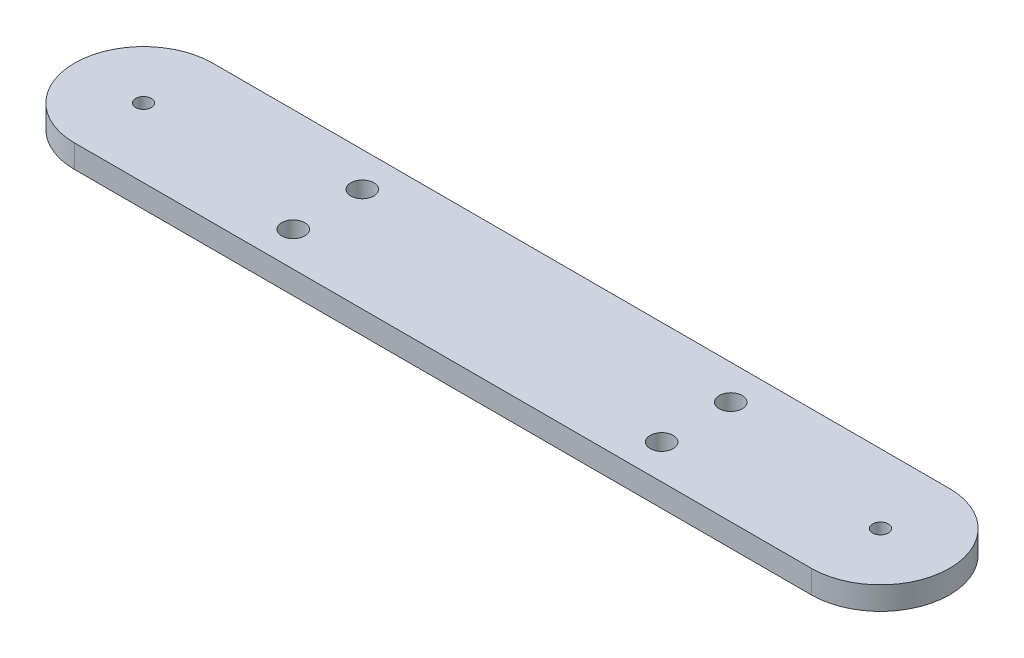
ISO-10303-21;
HEADER;
FILE_DESCRIPTION(('STEP AP214'),'2;1');
FILE_NAME('part.step','',(''),(''),'','','');
FILE_SCHEMA(('AUTOMOTIVE_DESIGN { 1 0 10303 214 1 1 1 1 }'));
ENDSEC;
DATA;
#1=APPLICATION_CONTEXT('core data for automotive mechanical design processes');
#2=APPLICATION_PROTOCOL_DEFINITION('international standard','automotive_design',2000,#1);
#3=PRODUCT_CONTEXT('',#1,'mechanical');
#4=PRODUCT('Part','Part','',(#3));
#5=PRODUCT_RELATED_PRODUCT_CATEGORY('part','',(#4));
#6=PRODUCT_DEFINITION_FORMATION('','',#4);
#7=PRODUCT_DEFINITION_CONTEXT('part definition',#1,'design');
#8=PRODUCT_DEFINITION('design','',#6,#7);
#9=PRODUCT_DEFINITION_SHAPE('','',#8);
#10=(LENGTH_UNIT() NAMED_UNIT(*) SI_UNIT(.MILLI.,.METRE.));
#11=(NAMED_UNIT(*) PLANE_ANGLE_UNIT() SI_UNIT($,.RADIAN.));
#12=(NAMED_UNIT(*) SI_UNIT($,.STERADIAN.) SOLID_ANGLE_UNIT());
#13=UNCERTAINTY_MEASURE_WITH_UNIT(LENGTH_MEASURE(1.E-05),#10,'distance_accuracy_value','');
#14=(GEOMETRIC_REPRESENTATION_CONTEXT(3) GLOBAL_UNCERTAINTY_ASSIGNED_CONTEXT((#13)) GLOBAL_UNIT_ASSIGNED_CONTEXT((#10,
#11,#12)) REPRESENTATION_CONTEXT('',''));
#15=CARTESIAN_POINT('',(0.,0.,0.));
#16=DIRECTION('',(0.,0.,1.));
#17=DIRECTION('',(1.,0.,0.));
#18=AXIS2_PLACEMENT_3D('',#15,#16,#17);
#19=CARTESIAN_POINT('',(0.,6.35,0.));
#20=DIRECTION('',(0.,1.,0.));
#21=DIRECTION('',(0.,0.,1.));
#22=AXIS2_PLACEMENT_3D('',#19,#20,#21);
#23=PLANE('',#22);
#24=CARTESIAN_POINT('',(152.4,6.35,9.525));
#25=DIRECTION('',(0.,1.,0.));
#26=DIRECTION('',(0.,0.,1.));
#27=AXIS2_PLACEMENT_3D('',#24,#25,#26);
#28=CIRCLE('',#27,3.175);
#29=CARTESIAN_POINT('',(152.4,6.35,12.7));
#30=VERTEX_POINT('',#29);
#31=EDGE_CURVE('E133',#30,#30,#28,.T.);
#32=ORIENTED_EDGE('',*,*,#31,.F.);
#33=EDGE_LOOP('',(#32));
#34=FACE_BOUND('',#33,.T.);
#35=CARTESIAN_POINT('',(50.8,6.35,-9.525));
#36=DIRECTION('',(0.,1.,0.));
#37=DIRECTION('',(0.,0.,1.));
#38=AXIS2_PLACEMENT_3D('',#35,#36,#37);
#39=CIRCLE('',#38,3.175);
#40=CARTESIAN_POINT('',(50.8,6.35,-6.35));
#41=VERTEX_POINT('',#40);
#42=EDGE_CURVE('E121',#41,#41,#39,.T.);
#43=ORIENTED_EDGE('',*,*,#42,.F.);
#44=EDGE_LOOP('',(#43));
#45=FACE_BOUND('',#44,.T.);
#46=CARTESIAN_POINT('',(0.,6.35,0.));
#47=DIRECTION('',(0.,1.,0.));
#48=DIRECTION('',(0.,0.,1.));
#49=AXIS2_PLACEMENT_3D('',#46,#47,#48);
#50=CIRCLE('',#49,2.1828125);
#51=CARTESIAN_POINT('',(0.,6.35,2.1828125));
#52=VERTEX_POINT('',#51);
#53=EDGE_CURVE('E100',#52,#52,#50,.T.);
#54=ORIENTED_EDGE('',*,*,#53,.F.);
#55=EDGE_LOOP('',(#54));
#56=FACE_BOUND('',#55,.T.);
#57=CARTESIAN_POINT('',(0.,6.35,0.));
#58=DIRECTION('',(0.,1.,0.));
#59=DIRECTION('',(0.,0.,1.));
#60=AXIS2_PLACEMENT_3D('',#57,#58,#59);
#61=CIRCLE('',#60,19.05);
#62=CARTESIAN_POINT('',(0.,6.35,-19.05));
#63=VERTEX_POINT('',#62);
#64=CARTESIAN_POINT('',(0.,6.35,19.05));
#65=VERTEX_POINT('',#64);
#66=EDGE_CURVE('E85',#63,#65,#61,.T.);
#67=ORIENTED_EDGE('',*,*,#66,.T.);
#68=DIRECTION('',(1.,0.,0.));
#69=VECTOR('',#68,1.);
#70=CARTESIAN_POINT('',(0.,6.35,19.05));
#71=LINE('',#70,#69);
#72=CARTESIAN_POINT('',(203.2,6.35,19.05));
#73=VERTEX_POINT('',#72);
#74=EDGE_CURVE('E80',#65,#73,#71,.T.);
#75=ORIENTED_EDGE('',*,*,#74,.T.);
#76=CARTESIAN_POINT('',(203.2,6.35,0.));
#77=DIRECTION('',(0.,1.,0.));
#78=DIRECTION('',(0.,0.,1.));
#79=AXIS2_PLACEMENT_3D('',#76,#77,#78);
#80=CIRCLE('',#79,19.05);
#81=CARTESIAN_POINT('',(203.2,6.35,-19.05));
#82=VERTEX_POINT('',#81);
#83=EDGE_CURVE('E83',#73,#82,#80,.T.);
#84=ORIENTED_EDGE('',*,*,#83,.T.);
#85=DIRECTION('',(-1.,0.,0.));
#86=VECTOR('',#85,1.);
#87=CARTESIAN_POINT('',(0.,6.35,-19.05));
#88=LINE('',#87,#86);
#89=EDGE_CURVE('E50',#82,#63,#88,.T.);
#90=ORIENTED_EDGE('',*,*,#89,.T.);
#91=EDGE_LOOP('',(#67,#75,#84,#90));
#92=FACE_BOUND('',#91,.T.);
#93=CARTESIAN_POINT('',(203.2,6.35,0.));
#94=DIRECTION('',(0.,1.,0.));
#95=DIRECTION('',(0.,0.,1.));
#96=AXIS2_PLACEMENT_3D('',#93,#94,#95);
#97=CIRCLE('',#96,2.1828125);
#98=CARTESIAN_POINT('',(203.2,6.35,2.1828125));
#99=VERTEX_POINT('',#98);
#100=EDGE_CURVE('E115',#99,#99,#97,.T.);
#101=ORIENTED_EDGE('',*,*,#100,.F.);
#102=EDGE_LOOP('',(#101));
#103=FACE_BOUND('',#102,.T.);
#104=CARTESIAN_POINT('',(152.4,6.35,-9.525));
#105=DIRECTION('',(0.,1.,0.));
#106=DIRECTION('',(0.,0.,1.));
#107=AXIS2_PLACEMENT_3D('',#104,#105,#106);
#108=CIRCLE('',#107,3.175);
#109=CARTESIAN_POINT('',(152.4,6.35,-6.35));
#110=VERTEX_POINT('',#109);
#111=EDGE_CURVE('E127',#110,#110,#108,.T.);
#112=ORIENTED_EDGE('',*,*,#111,.F.);
#113=EDGE_LOOP('',(#112));
#114=FACE_BOUND('',#113,.T.);
#115=CARTESIAN_POINT('',(50.8,6.35,9.525));
#116=DIRECTION('',(0.,1.,0.));
#117=DIRECTION('',(0.,0.,1.));
#118=AXIS2_PLACEMENT_3D('',#115,#116,#117);
#119=CIRCLE('',#118,3.175);
#120=CARTESIAN_POINT('',(50.8,6.35,12.7));
#121=VERTEX_POINT('',#120);
#122=EDGE_CURVE('E139',#121,#121,#119,.T.);
#123=ORIENTED_EDGE('',*,*,#122,.F.);
#124=EDGE_LOOP('',(#123));
#125=FACE_BOUND('',#124,.T.);
#126=ADVANCED_FACE('F33',(#34,#45,#56,#92,#103,#114,#125),#23,.T.);
#127=CARTESIAN_POINT('',(0.,0.,0.));
#128=DIRECTION('',(0.,1.,0.));
#129=DIRECTION('',(0.,0.,1.));
#130=AXIS2_PLACEMENT_3D('',#127,#128,#129);
#131=PLANE('',#130);
#132=CARTESIAN_POINT('',(0.,0.,0.));
#133=DIRECTION('',(0.,1.,0.));
#134=DIRECTION('',(0.,0.,1.));
#135=AXIS2_PLACEMENT_3D('',#132,#133,#134);
#136=CIRCLE('',#135,19.05);
#137=CARTESIAN_POINT('',(0.,0.,-19.05));
#138=VERTEX_POINT('',#137);
#139=CARTESIAN_POINT('',(0.,0.,19.05));
#140=VERTEX_POINT('',#139);
#141=EDGE_CURVE('E97',#138,#140,#136,.T.);
#142=ORIENTED_EDGE('',*,*,#141,.F.);
#143=DIRECTION('',(-1.,0.,0.));
#144=VECTOR('',#143,1.);
#145=CARTESIAN_POINT('',(0.,0.,-19.05));
#146=LINE('',#145,#144);
#147=CARTESIAN_POINT('',(203.2,0.,-19.05));
#148=VERTEX_POINT('',#147);
#149=EDGE_CURVE('E73',#148,#138,#146,.T.);
#150=ORIENTED_EDGE('',*,*,#149,.F.);
#151=CARTESIAN_POINT('',(203.2,0.,0.));
#152=DIRECTION('',(0.,1.,0.));
#153=DIRECTION('',(0.,0.,1.));
#154=AXIS2_PLACEMENT_3D('',#151,#152,#153);
#155=CIRCLE('',#154,19.05);
#156=CARTESIAN_POINT('',(203.2,0.,19.05));
#157=VERTEX_POINT('',#156);
#158=EDGE_CURVE('E67',#157,#148,#155,.T.);
#159=ORIENTED_EDGE('',*,*,#158,.F.);
#160=DIRECTION('',(1.,0.,0.));
#161=VECTOR('',#160,1.);
#162=CARTESIAN_POINT('',(0.,0.,19.05));
#163=LINE('',#162,#161);
#164=EDGE_CURVE('E89',#140,#157,#163,.T.);
#165=ORIENTED_EDGE('',*,*,#164,.F.);
#166=EDGE_LOOP('',(#142,#150,#159,#165));
#167=FACE_BOUND('',#166,.T.);
#168=CARTESIAN_POINT('',(0.,0.,0.));
#169=DIRECTION('',(0.,1.,0.));
#170=DIRECTION('',(0.,0.,1.));
#171=AXIS2_PLACEMENT_3D('',#168,#169,#170);
#172=CIRCLE('',#171,2.1828125);
#173=CARTESIAN_POINT('',(0.,0.,2.1828125));
#174=VERTEX_POINT('',#173);
#175=EDGE_CURVE('E112',#174,#174,#172,.T.);
#176=ORIENTED_EDGE('',*,*,#175,.T.);
#177=EDGE_LOOP('',(#176));
#178=FACE_BOUND('',#177,.T.);
#179=CARTESIAN_POINT('',(203.2,0.,0.));
#180=DIRECTION('',(0.,1.,0.));
#181=DIRECTION('',(0.,0.,1.));
#182=AXIS2_PLACEMENT_3D('',#179,#180,#181);
#183=CIRCLE('',#182,2.1828125);
#184=CARTESIAN_POINT('',(203.2,0.,2.1828125));
#185=VERTEX_POINT('',#184);
#186=EDGE_CURVE('E118',#185,#185,#183,.T.);
#187=ORIENTED_EDGE('',*,*,#186,.T.);
#188=EDGE_LOOP('',(#187));
#189=FACE_BOUND('',#188,.T.);
#190=CARTESIAN_POINT('',(50.8,0.,-9.525));
#191=DIRECTION('',(0.,1.,0.));
#192=DIRECTION('',(0.,0.,1.));
#193=AXIS2_PLACEMENT_3D('',#190,#191,#192);
#194=CIRCLE('',#193,3.175);
#195=CARTESIAN_POINT('',(50.8,0.,-6.35));
#196=VERTEX_POINT('',#195);
#197=EDGE_CURVE('E124',#196,#196,#194,.T.);
#198=ORIENTED_EDGE('',*,*,#197,.T.);
#199=EDGE_LOOP('',(#198));
#200=FACE_BOUND('',#199,.T.);
#201=CARTESIAN_POINT('',(152.4,0.,-9.525));
#202=DIRECTION('',(0.,1.,0.));
#203=DIRECTION('',(0.,0.,1.));
#204=AXIS2_PLACEMENT_3D('',#201,#202,#203);
#205=CIRCLE('',#204,3.175);
#206=CARTESIAN_POINT('',(152.4,0.,-6.35));
#207=VERTEX_POINT('',#206);
#208=EDGE_CURVE('E130',#207,#207,#205,.T.);
#209=ORIENTED_EDGE('',*,*,#208,.T.);
#210=EDGE_LOOP('',(#209));
#211=FACE_BOUND('',#210,.T.);
#212=CARTESIAN_POINT('',(152.4,0.,9.525));
#213=DIRECTION('',(0.,1.,0.));
#214=DIRECTION('',(0.,0.,1.));
#215=AXIS2_PLACEMENT_3D('',#212,#213,#214);
#216=CIRCLE('',#215,3.175);
#217=CARTESIAN_POINT('',(152.4,0.,12.7));
#218=VERTEX_POINT('',#217);
#219=EDGE_CURVE('E136',#218,#218,#216,.T.);
#220=ORIENTED_EDGE('',*,*,#219,.T.);
#221=EDGE_LOOP('',(#220));
#222=FACE_BOUND('',#221,.T.);
#223=CARTESIAN_POINT('',(50.8,0.,9.525));
#224=DIRECTION('',(0.,1.,0.));
#225=DIRECTION('',(0.,0.,1.));
#226=AXIS2_PLACEMENT_3D('',#223,#224,#225);
#227=CIRCLE('',#226,3.175);
#228=CARTESIAN_POINT('',(50.8,0.,12.7));
#229=VERTEX_POINT('',#228);
#230=EDGE_CURVE('E142',#229,#229,#227,.T.);
#231=ORIENTED_EDGE('',*,*,#230,.T.);
#232=EDGE_LOOP('',(#231));
#233=FACE_BOUND('',#232,.T.);
#234=ADVANCED_FACE('F108',(#167,#178,#189,#200,#211,#222,#233),#131,.F.);
#235=CARTESIAN_POINT('',(0.,6.35,0.));
#236=DIRECTION('',(0.,-1.,0.));
#237=DIRECTION('',(0.,0.,-1.));
#238=AXIS2_PLACEMENT_3D('',#235,#236,#237);
#239=CYLINDRICAL_SURFACE('',#238,19.05);
#240=ORIENTED_EDGE('',*,*,#141,.T.);
#241=DIRECTION('',(0.,-1.,0.));
#242=VECTOR('',#241,1.);
#243=CARTESIAN_POINT('',(0.,6.35,19.05));
#244=LINE('',#243,#242);
#245=EDGE_CURVE('E11',#65,#140,#244,.T.);
#246=ORIENTED_EDGE('',*,*,#245,.F.);
#247=ORIENTED_EDGE('',*,*,#66,.F.);
#248=DIRECTION('',(0.,-1.,0.));
#249=VECTOR('',#248,1.);
#250=CARTESIAN_POINT('',(0.,6.35,-19.05));
#251=LINE('',#250,#249);
#252=EDGE_CURVE('E93',#63,#138,#251,.T.);
#253=ORIENTED_EDGE('',*,*,#252,.T.);
#254=EDGE_LOOP('',(#240,#246,#247,#253));
#255=FACE_BOUND('',#254,.T.);
#256=ADVANCED_FACE('F35',(#255),#239,.T.);
#257=CARTESIAN_POINT('',(0.,6.35,19.05));
#258=DIRECTION('',(0.,0.,-1.));
#259=DIRECTION('',(-1.,0.,0.));
#260=AXIS2_PLACEMENT_3D('',#257,#258,#259);
#261=PLANE('',#260);
#262=ORIENTED_EDGE('',*,*,#164,.T.);
#263=DIRECTION('',(0.,-1.,0.));
#264=VECTOR('',#263,1.);
#265=CARTESIAN_POINT('',(203.2,6.35,19.05));
#266=LINE('',#265,#264);
#267=EDGE_CURVE('E42',#73,#157,#266,.T.);
#268=ORIENTED_EDGE('',*,*,#267,.F.);
#269=ORIENTED_EDGE('',*,*,#74,.F.);
#270=ORIENTED_EDGE('',*,*,#245,.T.);
#271=EDGE_LOOP('',(#262,#268,#269,#270));
#272=FACE_BOUND('',#271,.T.);
#273=ADVANCED_FACE('F88',(#272),#261,.F.);
#274=CARTESIAN_POINT('',(203.2,6.35,0.));
#275=DIRECTION('',(0.,-1.,0.));
#276=DIRECTION('',(0.,0.,-1.));
#277=AXIS2_PLACEMENT_3D('',#274,#275,#276);
#278=CYLINDRICAL_SURFACE('',#277,19.05);
#279=ORIENTED_EDGE('',*,*,#158,.T.);
#280=DIRECTION('',(0.,-1.,0.));
#281=VECTOR('',#280,1.);
#282=CARTESIAN_POINT('',(203.2,6.35,-19.05));
#283=LINE('',#282,#281);
#284=EDGE_CURVE('E90',#82,#148,#283,.T.);
#285=ORIENTED_EDGE('',*,*,#284,.F.);
#286=ORIENTED_EDGE('',*,*,#83,.F.);
#287=ORIENTED_EDGE('',*,*,#267,.T.);
#288=EDGE_LOOP('',(#279,#285,#286,#287));
#289=FACE_BOUND('',#288,.T.);
#290=ADVANCED_FACE('F91',(#289),#278,.T.);
#291=CARTESIAN_POINT('',(0.,6.35,-19.05));
#292=DIRECTION('',(0.,0.,1.));
#293=DIRECTION('',(1.,0.,0.));
#294=AXIS2_PLACEMENT_3D('',#291,#292,#293);
#295=PLANE('',#294);
#296=ORIENTED_EDGE('',*,*,#149,.T.);
#297=ORIENTED_EDGE('',*,*,#252,.F.);
#298=ORIENTED_EDGE('',*,*,#89,.F.);
#299=ORIENTED_EDGE('',*,*,#284,.T.);
#300=EDGE_LOOP('',(#296,#297,#298,#299));
#301=FACE_BOUND('',#300,.T.);
#302=ADVANCED_FACE('F105',(#301),#295,.F.);
#303=CARTESIAN_POINT('',(0.,6.35,0.));
#304=DIRECTION('',(0.,-1.,0.));
#305=DIRECTION('',(0.,0.,-1.));
#306=AXIS2_PLACEMENT_3D('',#303,#304,#305);
#307=CYLINDRICAL_SURFACE('',#306,2.1828125);
#308=ORIENTED_EDGE('',*,*,#53,.T.);
#309=EDGE_LOOP('',(#308));
#310=FACE_BOUND('',#309,.T.);
#311=ORIENTED_EDGE('',*,*,#175,.F.);
#312=EDGE_LOOP('',(#311));
#313=FACE_BOUND('',#312,.T.);
#314=ADVANCED_FACE('F161',(#310,#313),#307,.F.);
#315=CARTESIAN_POINT('',(203.2,6.35,0.));
#316=DIRECTION('',(0.,-1.,0.));
#317=DIRECTION('',(0.,0.,-1.));
#318=AXIS2_PLACEMENT_3D('',#315,#316,#317);
#319=CYLINDRICAL_SURFACE('',#318,2.1828125);
#320=ORIENTED_EDGE('',*,*,#100,.T.);
#321=EDGE_LOOP('',(#320));
#322=FACE_BOUND('',#321,.T.);
#323=ORIENTED_EDGE('',*,*,#186,.F.);
#324=EDGE_LOOP('',(#323));
#325=FACE_BOUND('',#324,.T.);
#326=ADVANCED_FACE('F207',(#322,#325),#319,.F.);
#327=CARTESIAN_POINT('',(50.8,6.35,-9.525));
#328=DIRECTION('',(0.,-1.,0.));
#329=DIRECTION('',(0.,0.,-1.));
#330=AXIS2_PLACEMENT_3D('',#327,#328,#329);
#331=CYLINDRICAL_SURFACE('',#330,3.175);
#332=ORIENTED_EDGE('',*,*,#42,.T.);
#333=EDGE_LOOP('',(#332));
#334=FACE_BOUND('',#333,.T.);
#335=ORIENTED_EDGE('',*,*,#197,.F.);
#336=EDGE_LOOP('',(#335));
#337=FACE_BOUND('',#336,.T.);
#338=ADVANCED_FACE('F215',(#334,#337),#331,.F.);
#339=CARTESIAN_POINT('',(152.4,6.35,-9.525));
#340=DIRECTION('',(0.,-1.,0.));
#341=DIRECTION('',(0.,0.,-1.));
#342=AXIS2_PLACEMENT_3D('',#339,#340,#341);
#343=CYLINDRICAL_SURFACE('',#342,3.175);
#344=ORIENTED_EDGE('',*,*,#111,.T.);
#345=EDGE_LOOP('',(#344));
#346=FACE_BOUND('',#345,.T.);
#347=ORIENTED_EDGE('',*,*,#208,.F.);
#348=EDGE_LOOP('',(#347));
#349=FACE_BOUND('',#348,.T.);
#350=ADVANCED_FACE('F223',(#346,#349),#343,.F.);
#351=CARTESIAN_POINT('',(152.4,6.35,9.525));
#352=DIRECTION('',(0.,-1.,0.));
#353=DIRECTION('',(0.,0.,-1.));
#354=AXIS2_PLACEMENT_3D('',#351,#352,#353);
#355=CYLINDRICAL_SURFACE('',#354,3.175);
#356=ORIENTED_EDGE('',*,*,#31,.T.);
#357=EDGE_LOOP('',(#356));
#358=FACE_BOUND('',#357,.T.);
#359=ORIENTED_EDGE('',*,*,#219,.F.);
#360=EDGE_LOOP('',(#359));
#361=FACE_BOUND('',#360,.T.);
#362=ADVANCED_FACE('F232',(#358,#361),#355,.F.);
#363=CARTESIAN_POINT('',(50.8,6.35,9.525));
#364=DIRECTION('',(0.,-1.,0.));
#365=DIRECTION('',(0.,0.,-1.));
#366=AXIS2_PLACEMENT_3D('',#363,#364,#365);
#367=CYLINDRICAL_SURFACE('',#366,3.175);
#368=ORIENTED_EDGE('',*,*,#122,.T.);
#369=EDGE_LOOP('',(#368));
#370=FACE_BOUND('',#369,.T.);
#371=ORIENTED_EDGE('',*,*,#230,.F.);
#372=EDGE_LOOP('',(#371));
#373=FACE_BOUND('',#372,.T.);
#374=ADVANCED_FACE('F148',(#370,#373),#367,.F.);
#375=CLOSED_SHELL('',(#126,#234,#256,#273,#290,#302,#314,#326,#338,#350,#362,#374));
#376=MANIFOLD_SOLID_BREP('B2',#375);
#377=ADVANCED_BREP_SHAPE_REPRESENTATION('',(#18,#376),#14);
#378=SHAPE_DEFINITION_REPRESENTATION(#9,#377);
ENDSEC;
END-ISO-10303-21;
